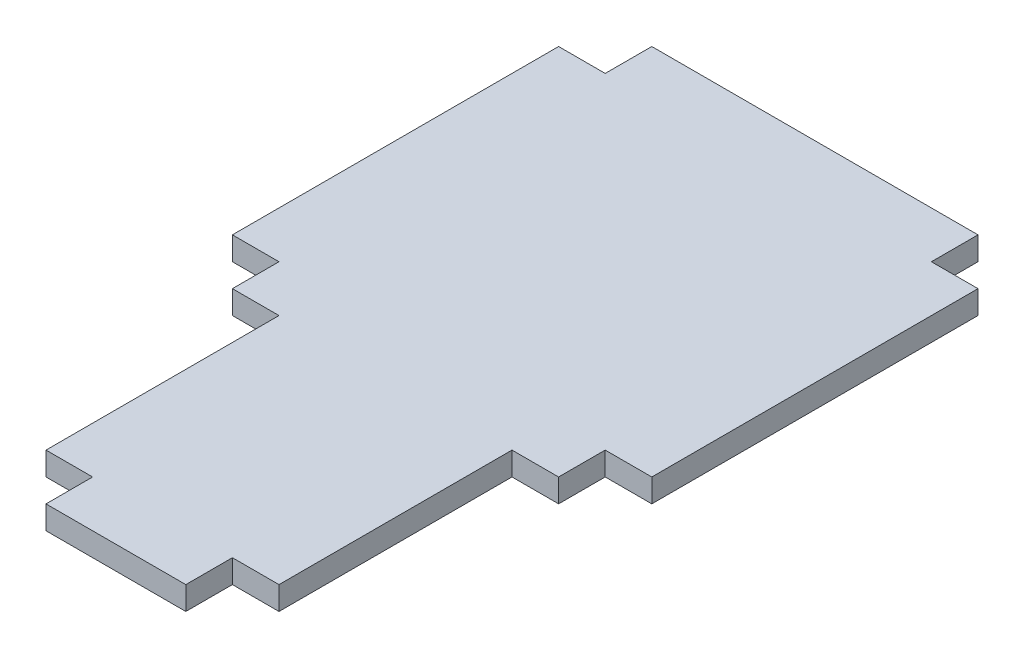
ISO-10303-21;
HEADER;
FILE_DESCRIPTION(('STEP AP214'),'2;1');
FILE_NAME('part.step','',(''),(''),'','','');
FILE_SCHEMA(('AUTOMOTIVE_DESIGN { 1 0 10303 214 1 1 1 1 }'));
ENDSEC;
DATA;
#1=APPLICATION_CONTEXT('core data for automotive mechanical design processes');
#2=APPLICATION_PROTOCOL_DEFINITION('international standard','automotive_design',2000,#1);
#3=PRODUCT_CONTEXT('',#1,'mechanical');
#4=PRODUCT('Part','Part','',(#3));
#5=PRODUCT_RELATED_PRODUCT_CATEGORY('part','',(#4));
#6=PRODUCT_DEFINITION_FORMATION('','',#4);
#7=PRODUCT_DEFINITION_CONTEXT('part definition',#1,'design');
#8=PRODUCT_DEFINITION('design','',#6,#7);
#9=PRODUCT_DEFINITION_SHAPE('','',#8);
#10=(LENGTH_UNIT() NAMED_UNIT(*) SI_UNIT(.MILLI.,.METRE.));
#11=(NAMED_UNIT(*) PLANE_ANGLE_UNIT() SI_UNIT($,.RADIAN.));
#12=(NAMED_UNIT(*) SI_UNIT($,.STERADIAN.) SOLID_ANGLE_UNIT());
#13=UNCERTAINTY_MEASURE_WITH_UNIT(LENGTH_MEASURE(1.E-05),#10,'distance_accuracy_value','');
#14=(GEOMETRIC_REPRESENTATION_CONTEXT(3) GLOBAL_UNCERTAINTY_ASSIGNED_CONTEXT((#13)) GLOBAL_UNIT_ASSIGNED_CONTEXT((#10,
#11,#12)) REPRESENTATION_CONTEXT('',''));
#15=CARTESIAN_POINT('',(0.,0.,0.));
#16=DIRECTION('',(0.,0.,1.));
#17=DIRECTION('',(1.,0.,0.));
#18=AXIS2_PLACEMENT_3D('',#15,#16,#17);
#19=CARTESIAN_POINT('',(-9.525,-3.175,66.675));
#20=DIRECTION('',(-1.,0.,0.));
#21=DIRECTION('',(0.,0.,1.));
#22=AXIS2_PLACEMENT_3D('',#19,#20,#21);
#23=PLANE('',#22);
#24=DIRECTION('',(0.,0.,1.));
#25=VECTOR('',#24,1.);
#26=CARTESIAN_POINT('',(-9.525,0.,66.675));
#27=LINE('',#26,#25);
#28=CARTESIAN_POINT('',(-9.525,0.,60.325));
#29=VERTEX_POINT('',#28);
#30=CARTESIAN_POINT('',(-9.525,0.,66.675));
#31=VERTEX_POINT('',#30);
#32=EDGE_CURVE('E192',#29,#31,#27,.T.);
#33=ORIENTED_EDGE('',*,*,#32,.F.);
#34=DIRECTION('',(0.,1.,0.));
#35=VECTOR('',#34,1.);
#36=CARTESIAN_POINT('',(-9.525,-3.175,60.325));
#37=LINE('',#36,#35);
#38=CARTESIAN_POINT('',(-9.525,-3.175,60.325));
#39=VERTEX_POINT('',#38);
#40=EDGE_CURVE('E32',#39,#29,#37,.T.);
#41=ORIENTED_EDGE('',*,*,#40,.F.);
#42=DIRECTION('',(0.,0.,1.));
#43=VECTOR('',#42,1.);
#44=CARTESIAN_POINT('',(-9.525,-3.175,66.675));
#45=LINE('',#44,#43);
#46=CARTESIAN_POINT('',(-9.525,-3.175,66.675));
#47=VERTEX_POINT('',#46);
#48=EDGE_CURVE('E183',#39,#47,#45,.T.);
#49=ORIENTED_EDGE('',*,*,#48,.T.);
#50=DIRECTION('',(0.,1.,0.));
#51=VECTOR('',#50,1.);
#52=CARTESIAN_POINT('',(-9.525,-3.175,66.675));
#53=LINE('',#52,#51);
#54=EDGE_CURVE('E10',#47,#31,#53,.T.);
#55=ORIENTED_EDGE('',*,*,#54,.T.);
#56=EDGE_LOOP('',(#33,#41,#49,#55));
#57=FACE_BOUND('',#56,.T.);
#58=ADVANCED_FACE('F16',(#57),#23,.T.);
#59=CARTESIAN_POINT('',(0.,-3.175,66.675));
#60=DIRECTION('',(0.,0.,1.));
#61=DIRECTION('',(1.,0.,0.));
#62=AXIS2_PLACEMENT_3D('',#59,#60,#61);
#63=PLANE('',#62);
#64=DIRECTION('',(1.,0.,0.));
#65=VECTOR('',#64,1.);
#66=CARTESIAN_POINT('',(0.,0.,66.675));
#67=LINE('',#66,#65);
#68=CARTESIAN_POINT('',(9.525,0.,66.675));
#69=VERTEX_POINT('',#68);
#70=EDGE_CURVE('E187',#31,#69,#67,.T.);
#71=ORIENTED_EDGE('',*,*,#70,.F.);
#72=ORIENTED_EDGE('',*,*,#54,.F.);
#73=DIRECTION('',(1.,0.,0.));
#74=VECTOR('',#73,1.);
#75=CARTESIAN_POINT('',(-9.525,-3.175,66.675));
#76=LINE('',#75,#74);
#77=CARTESIAN_POINT('',(9.525,-3.175,66.675));
#78=VERTEX_POINT('',#77);
#79=EDGE_CURVE('E185',#47,#78,#76,.T.);
#80=ORIENTED_EDGE('',*,*,#79,.T.);
#81=DIRECTION('',(0.,1.,0.));
#82=VECTOR('',#81,1.);
#83=CARTESIAN_POINT('',(9.525,-3.175,66.675));
#84=LINE('',#83,#82);
#85=EDGE_CURVE('E24',#78,#69,#84,.T.);
#86=ORIENTED_EDGE('',*,*,#85,.T.);
#87=EDGE_LOOP('',(#71,#72,#80,#86));
#88=FACE_BOUND('',#87,.T.);
#89=ADVANCED_FACE('F294',(#88),#63,.T.);
#90=CARTESIAN_POINT('',(9.525,-3.175,60.325));
#91=DIRECTION('',(1.,0.,0.));
#92=DIRECTION('',(0.,0.,-1.));
#93=AXIS2_PLACEMENT_3D('',#90,#91,#92);
#94=PLANE('',#93);
#95=DIRECTION('',(0.,0.,-1.));
#96=VECTOR('',#95,1.);
#97=CARTESIAN_POINT('',(9.525,0.,60.325));
#98=LINE('',#97,#96);
#99=CARTESIAN_POINT('',(9.525,0.,60.325));
#100=VERTEX_POINT('',#99);
#101=EDGE_CURVE('E191',#69,#100,#98,.T.);
#102=ORIENTED_EDGE('',*,*,#101,.F.);
#103=ORIENTED_EDGE('',*,*,#85,.F.);
#104=DIRECTION('',(0.,0.,-1.));
#105=VECTOR('',#104,1.);
#106=CARTESIAN_POINT('',(9.525,-3.175,60.325));
#107=LINE('',#106,#105);
#108=CARTESIAN_POINT('',(9.525,-3.175,60.325));
#109=VERTEX_POINT('',#108);
#110=EDGE_CURVE('E303',#78,#109,#107,.T.);
#111=ORIENTED_EDGE('',*,*,#110,.T.);
#112=DIRECTION('',(0.,1.,0.));
#113=VECTOR('',#112,1.);
#114=CARTESIAN_POINT('',(9.525,-3.175,60.325));
#115=LINE('',#114,#113);
#116=EDGE_CURVE('E291',#109,#100,#115,.T.);
#117=ORIENTED_EDGE('',*,*,#116,.T.);
#118=EDGE_LOOP('',(#102,#103,#111,#117));
#119=FACE_BOUND('',#118,.T.);
#120=ADVANCED_FACE('F298',(#119),#94,.T.);
#121=CARTESIAN_POINT('',(15.875,-3.175,60.325));
#122=DIRECTION('',(0.,0.,1.));
#123=DIRECTION('',(1.,0.,0.));
#124=AXIS2_PLACEMENT_3D('',#121,#122,#123);
#125=PLANE('',#124);
#126=DIRECTION('',(1.,0.,0.));
#127=VECTOR('',#126,1.);
#128=CARTESIAN_POINT('',(15.875,0.,60.325));
#129=LINE('',#128,#127);
#130=CARTESIAN_POINT('',(15.875,0.,60.325));
#131=VERTEX_POINT('',#130);
#132=EDGE_CURVE('E196',#100,#131,#129,.T.);
#133=ORIENTED_EDGE('',*,*,#132,.F.);
#134=ORIENTED_EDGE('',*,*,#116,.F.);
#135=DIRECTION('',(1.,0.,0.));
#136=VECTOR('',#135,1.);
#137=CARTESIAN_POINT('',(15.875,-3.175,60.325));
#138=LINE('',#137,#136);
#139=CARTESIAN_POINT('',(15.875,-3.175,60.325));
#140=VERTEX_POINT('',#139);
#141=EDGE_CURVE('E305',#109,#140,#138,.T.);
#142=ORIENTED_EDGE('',*,*,#141,.T.);
#143=DIRECTION('',(0.,1.,0.));
#144=VECTOR('',#143,1.);
#145=CARTESIAN_POINT('',(15.875,-3.175,60.325));
#146=LINE('',#145,#144);
#147=EDGE_CURVE('E289',#140,#131,#146,.T.);
#148=ORIENTED_EDGE('',*,*,#147,.T.);
#149=EDGE_LOOP('',(#133,#134,#142,#148));
#150=FACE_BOUND('',#149,.T.);
#151=ADVANCED_FACE('F397',(#150),#125,.T.);
#152=CARTESIAN_POINT('',(15.875,-3.175,60.325));
#153=DIRECTION('',(1.,0.,0.));
#154=DIRECTION('',(0.,0.,-1.));
#155=AXIS2_PLACEMENT_3D('',#152,#153,#154);
#156=PLANE('',#155);
#157=DIRECTION('',(0.,0.,-1.));
#158=VECTOR('',#157,1.);
#159=CARTESIAN_POINT('',(15.875,0.,60.325));
#160=LINE('',#159,#158);
#161=CARTESIAN_POINT('',(15.875,0.,28.575));
#162=VERTEX_POINT('',#161);
#163=EDGE_CURVE('E200',#131,#162,#160,.T.);
#164=ORIENTED_EDGE('',*,*,#163,.F.);
#165=ORIENTED_EDGE('',*,*,#147,.F.);
#166=DIRECTION('',(0.,0.,-1.));
#167=VECTOR('',#166,1.);
#168=CARTESIAN_POINT('',(15.875,-3.175,60.325));
#169=LINE('',#168,#167);
#170=CARTESIAN_POINT('',(15.875,-3.175,28.575));
#171=VERTEX_POINT('',#170);
#172=EDGE_CURVE('E310',#140,#171,#169,.T.);
#173=ORIENTED_EDGE('',*,*,#172,.T.);
#174=DIRECTION('',(0.,1.,0.));
#175=VECTOR('',#174,1.);
#176=CARTESIAN_POINT('',(15.875,-3.175,28.575));
#177=LINE('',#176,#175);
#178=EDGE_CURVE('E287',#171,#162,#177,.T.);
#179=ORIENTED_EDGE('',*,*,#178,.T.);
#180=EDGE_LOOP('',(#164,#165,#173,#179));
#181=FACE_BOUND('',#180,.T.);
#182=ADVANCED_FACE('F395',(#181),#156,.T.);
#183=CARTESIAN_POINT('',(15.875,-3.175,28.575));
#184=DIRECTION('',(0.,0.,1.));
#185=DIRECTION('',(1.,0.,0.));
#186=AXIS2_PLACEMENT_3D('',#183,#184,#185);
#187=PLANE('',#186);
#188=DIRECTION('',(1.,0.,0.));
#189=VECTOR('',#188,1.);
#190=CARTESIAN_POINT('',(15.875,0.,28.575));
#191=LINE('',#190,#189);
#192=CARTESIAN_POINT('',(22.225,0.,28.575));
#193=VERTEX_POINT('',#192);
#194=EDGE_CURVE('E204',#162,#193,#191,.T.);
#195=ORIENTED_EDGE('',*,*,#194,.F.);
#196=ORIENTED_EDGE('',*,*,#178,.F.);
#197=DIRECTION('',(1.,0.,0.));
#198=VECTOR('',#197,1.);
#199=CARTESIAN_POINT('',(15.875,-3.175,28.575));
#200=LINE('',#199,#198);
#201=CARTESIAN_POINT('',(22.225,-3.175,28.575));
#202=VERTEX_POINT('',#201);
#203=EDGE_CURVE('E313',#171,#202,#200,.T.);
#204=ORIENTED_EDGE('',*,*,#203,.T.);
#205=DIRECTION('',(0.,1.,0.));
#206=VECTOR('',#205,1.);
#207=CARTESIAN_POINT('',(22.225,-3.175,28.575));
#208=LINE('',#207,#206);
#209=EDGE_CURVE('E285',#202,#193,#208,.T.);
#210=ORIENTED_EDGE('',*,*,#209,.T.);
#211=EDGE_LOOP('',(#195,#196,#204,#210));
#212=FACE_BOUND('',#211,.T.);
#213=ADVANCED_FACE('F392',(#212),#187,.T.);
#214=CARTESIAN_POINT('',(22.225,-3.175,22.225));
#215=DIRECTION('',(1.,0.,0.));
#216=DIRECTION('',(0.,0.,-1.));
#217=AXIS2_PLACEMENT_3D('',#214,#215,#216);
#218=PLANE('',#217);
#219=DIRECTION('',(0.,0.,-1.));
#220=VECTOR('',#219,1.);
#221=CARTESIAN_POINT('',(22.225,0.,22.225));
#222=LINE('',#221,#220);
#223=CARTESIAN_POINT('',(22.225,0.,22.225));
#224=VERTEX_POINT('',#223);
#225=EDGE_CURVE('E208',#193,#224,#222,.T.);
#226=ORIENTED_EDGE('',*,*,#225,.F.);
#227=ORIENTED_EDGE('',*,*,#209,.F.);
#228=DIRECTION('',(0.,0.,-1.));
#229=VECTOR('',#228,1.);
#230=CARTESIAN_POINT('',(22.225,-3.175,22.225));
#231=LINE('',#230,#229);
#232=CARTESIAN_POINT('',(22.225,-3.175,22.225));
#233=VERTEX_POINT('',#232);
#234=EDGE_CURVE('E316',#202,#233,#231,.T.);
#235=ORIENTED_EDGE('',*,*,#234,.T.);
#236=DIRECTION('',(0.,1.,0.));
#237=VECTOR('',#236,1.);
#238=CARTESIAN_POINT('',(22.225,-3.175,22.225));
#239=LINE('',#238,#237);
#240=EDGE_CURVE('E283',#233,#224,#239,.T.);
#241=ORIENTED_EDGE('',*,*,#240,.T.);
#242=EDGE_LOOP('',(#226,#227,#235,#241));
#243=FACE_BOUND('',#242,.T.);
#244=ADVANCED_FACE('F389',(#243),#218,.T.);
#245=CARTESIAN_POINT('',(28.575,-3.175,22.225));
#246=DIRECTION('',(0.,0.,1.));
#247=DIRECTION('',(1.,0.,0.));
#248=AXIS2_PLACEMENT_3D('',#245,#246,#247);
#249=PLANE('',#248);
#250=DIRECTION('',(1.,0.,0.));
#251=VECTOR('',#250,1.);
#252=CARTESIAN_POINT('',(28.575,0.,22.225));
#253=LINE('',#252,#251);
#254=CARTESIAN_POINT('',(28.575,0.,22.225));
#255=VERTEX_POINT('',#254);
#256=EDGE_CURVE('E212',#224,#255,#253,.T.);
#257=ORIENTED_EDGE('',*,*,#256,.F.);
#258=ORIENTED_EDGE('',*,*,#240,.F.);
#259=DIRECTION('',(1.,0.,0.));
#260=VECTOR('',#259,1.);
#261=CARTESIAN_POINT('',(28.575,-3.175,22.225));
#262=LINE('',#261,#260);
#263=CARTESIAN_POINT('',(28.575,-3.175,22.225));
#264=VERTEX_POINT('',#263);
#265=EDGE_CURVE('E319',#233,#264,#262,.T.);
#266=ORIENTED_EDGE('',*,*,#265,.T.);
#267=DIRECTION('',(0.,1.,0.));
#268=VECTOR('',#267,1.);
#269=CARTESIAN_POINT('',(28.575,-3.175,22.225));
#270=LINE('',#269,#268);
#271=EDGE_CURVE('E281',#264,#255,#270,.T.);
#272=ORIENTED_EDGE('',*,*,#271,.T.);
#273=EDGE_LOOP('',(#257,#258,#266,#272));
#274=FACE_BOUND('',#273,.T.);
#275=ADVANCED_FACE('F383',(#274),#249,.T.);
#276=CARTESIAN_POINT('',(28.575,-3.175,22.225));
#277=DIRECTION('',(1.,0.,0.));
#278=DIRECTION('',(0.,0.,-1.));
#279=AXIS2_PLACEMENT_3D('',#276,#277,#278);
#280=PLANE('',#279);
#281=DIRECTION('',(0.,0.,-1.));
#282=VECTOR('',#281,1.);
#283=CARTESIAN_POINT('',(28.575,0.,22.225));
#284=LINE('',#283,#282);
#285=CARTESIAN_POINT('',(28.575,0.,-22.225));
#286=VERTEX_POINT('',#285);
#287=EDGE_CURVE('E216',#255,#286,#284,.T.);
#288=ORIENTED_EDGE('',*,*,#287,.F.);
#289=ORIENTED_EDGE('',*,*,#271,.F.);
#290=DIRECTION('',(0.,0.,-1.));
#291=VECTOR('',#290,1.);
#292=CARTESIAN_POINT('',(28.575,-3.175,22.225));
#293=LINE('',#292,#291);
#294=CARTESIAN_POINT('',(28.575,-3.175,-22.225));
#295=VERTEX_POINT('',#294);
#296=EDGE_CURVE('E322',#264,#295,#293,.T.);
#297=ORIENTED_EDGE('',*,*,#296,.T.);
#298=DIRECTION('',(0.,1.,0.));
#299=VECTOR('',#298,1.);
#300=CARTESIAN_POINT('',(28.575,-3.175,-22.225));
#301=LINE('',#300,#299);
#302=EDGE_CURVE('E279',#295,#286,#301,.T.);
#303=ORIENTED_EDGE('',*,*,#302,.T.);
#304=EDGE_LOOP('',(#288,#289,#297,#303));
#305=FACE_BOUND('',#304,.T.);
#306=ADVANCED_FACE('F380',(#305),#280,.T.);
#307=CARTESIAN_POINT('',(22.225,-3.175,-22.225));
#308=DIRECTION('',(0.,0.,-1.));
#309=DIRECTION('',(-1.,0.,0.));
#310=AXIS2_PLACEMENT_3D('',#307,#308,#309);
#311=PLANE('',#310);
#312=DIRECTION('',(-1.,0.,0.));
#313=VECTOR('',#312,1.);
#314=CARTESIAN_POINT('',(22.225,0.,-22.225));
#315=LINE('',#314,#313);
#316=CARTESIAN_POINT('',(22.225,0.,-22.225));
#317=VERTEX_POINT('',#316);
#318=EDGE_CURVE('E220',#286,#317,#315,.T.);
#319=ORIENTED_EDGE('',*,*,#318,.F.);
#320=ORIENTED_EDGE('',*,*,#302,.F.);
#321=DIRECTION('',(-1.,0.,0.));
#322=VECTOR('',#321,1.);
#323=CARTESIAN_POINT('',(22.225,-3.175,-22.225));
#324=LINE('',#323,#322);
#325=CARTESIAN_POINT('',(22.225,-3.175,-22.225));
#326=VERTEX_POINT('',#325);
#327=EDGE_CURVE('E325',#295,#326,#324,.T.);
#328=ORIENTED_EDGE('',*,*,#327,.T.);
#329=DIRECTION('',(0.,1.,0.));
#330=VECTOR('',#329,1.);
#331=CARTESIAN_POINT('',(22.225,-3.175,-22.225));
#332=LINE('',#331,#330);
#333=EDGE_CURVE('E277',#326,#317,#332,.T.);
#334=ORIENTED_EDGE('',*,*,#333,.T.);
#335=EDGE_LOOP('',(#319,#320,#328,#334));
#336=FACE_BOUND('',#335,.T.);
#337=ADVANCED_FACE('F377',(#336),#311,.T.);
#338=CARTESIAN_POINT('',(22.225,-3.175,-28.575));
#339=DIRECTION('',(1.,0.,0.));
#340=DIRECTION('',(0.,0.,-1.));
#341=AXIS2_PLACEMENT_3D('',#338,#339,#340);
#342=PLANE('',#341);
#343=DIRECTION('',(0.,0.,-1.));
#344=VECTOR('',#343,1.);
#345=CARTESIAN_POINT('',(22.225,0.,-28.575));
#346=LINE('',#345,#344);
#347=CARTESIAN_POINT('',(22.225,0.,-28.575));
#348=VERTEX_POINT('',#347);
#349=EDGE_CURVE('E224',#317,#348,#346,.T.);
#350=ORIENTED_EDGE('',*,*,#349,.F.);
#351=ORIENTED_EDGE('',*,*,#333,.F.);
#352=DIRECTION('',(0.,0.,-1.));
#353=VECTOR('',#352,1.);
#354=CARTESIAN_POINT('',(22.225,-3.175,-28.575));
#355=LINE('',#354,#353);
#356=CARTESIAN_POINT('',(22.225,-3.175,-28.575));
#357=VERTEX_POINT('',#356);
#358=EDGE_CURVE('E328',#326,#357,#355,.T.);
#359=ORIENTED_EDGE('',*,*,#358,.T.);
#360=DIRECTION('',(0.,1.,0.));
#361=VECTOR('',#360,1.);
#362=CARTESIAN_POINT('',(22.225,-3.175,-28.575));
#363=LINE('',#362,#361);
#364=EDGE_CURVE('E275',#357,#348,#363,.T.);
#365=ORIENTED_EDGE('',*,*,#364,.T.);
#366=EDGE_LOOP('',(#350,#351,#359,#365));
#367=FACE_BOUND('',#366,.T.);
#368=ADVANCED_FACE('F371',(#367),#342,.T.);
#369=CARTESIAN_POINT('',(22.225,-3.175,-28.575));
#370=DIRECTION('',(0.,0.,-1.));
#371=DIRECTION('',(-1.,0.,0.));
#372=AXIS2_PLACEMENT_3D('',#369,#370,#371);
#373=PLANE('',#372);
#374=DIRECTION('',(-1.,0.,0.));
#375=VECTOR('',#374,1.);
#376=CARTESIAN_POINT('',(22.225,0.,-28.575));
#377=LINE('',#376,#375);
#378=CARTESIAN_POINT('',(-22.225,0.,-28.575));
#379=VERTEX_POINT('',#378);
#380=EDGE_CURVE('E228',#348,#379,#377,.T.);
#381=ORIENTED_EDGE('',*,*,#380,.F.);
#382=ORIENTED_EDGE('',*,*,#364,.F.);
#383=DIRECTION('',(-1.,0.,0.));
#384=VECTOR('',#383,1.);
#385=CARTESIAN_POINT('',(22.225,-3.175,-28.575));
#386=LINE('',#385,#384);
#387=CARTESIAN_POINT('',(-22.225,-3.175,-28.575));
#388=VERTEX_POINT('',#387);
#389=EDGE_CURVE('E331',#357,#388,#386,.T.);
#390=ORIENTED_EDGE('',*,*,#389,.T.);
#391=DIRECTION('',(0.,1.,0.));
#392=VECTOR('',#391,1.);
#393=CARTESIAN_POINT('',(-22.225,-3.175,-28.575));
#394=LINE('',#393,#392);
#395=EDGE_CURVE('E273',#388,#379,#394,.T.);
#396=ORIENTED_EDGE('',*,*,#395,.T.);
#397=EDGE_LOOP('',(#381,#382,#390,#396));
#398=FACE_BOUND('',#397,.T.);
#399=ADVANCED_FACE('F368',(#398),#373,.T.);
#400=CARTESIAN_POINT('',(-22.225,-3.175,-22.225));
#401=DIRECTION('',(-1.,0.,0.));
#402=DIRECTION('',(0.,0.,1.));
#403=AXIS2_PLACEMENT_3D('',#400,#401,#402);
#404=PLANE('',#403);
#405=DIRECTION('',(0.,0.,1.));
#406=VECTOR('',#405,1.);
#407=CARTESIAN_POINT('',(-22.225,0.,-22.225));
#408=LINE('',#407,#406);
#409=CARTESIAN_POINT('',(-22.225,0.,-22.225));
#410=VERTEX_POINT('',#409);
#411=EDGE_CURVE('E232',#379,#410,#408,.T.);
#412=ORIENTED_EDGE('',*,*,#411,.F.);
#413=ORIENTED_EDGE('',*,*,#395,.F.);
#414=DIRECTION('',(0.,0.,1.));
#415=VECTOR('',#414,1.);
#416=CARTESIAN_POINT('',(-22.225,-3.175,-22.225));
#417=LINE('',#416,#415);
#418=CARTESIAN_POINT('',(-22.225,-3.175,-22.225));
#419=VERTEX_POINT('',#418);
#420=EDGE_CURVE('E334',#388,#419,#417,.T.);
#421=ORIENTED_EDGE('',*,*,#420,.T.);
#422=DIRECTION('',(0.,1.,0.));
#423=VECTOR('',#422,1.);
#424=CARTESIAN_POINT('',(-22.225,-3.175,-22.225));
#425=LINE('',#424,#423);
#426=EDGE_CURVE('E271',#419,#410,#425,.T.);
#427=ORIENTED_EDGE('',*,*,#426,.T.);
#428=EDGE_LOOP('',(#412,#413,#421,#427));
#429=FACE_BOUND('',#428,.T.);
#430=ADVANCED_FACE('F365',(#429),#404,.T.);
#431=CARTESIAN_POINT('',(-28.575,-3.175,-22.225));
#432=DIRECTION('',(0.,0.,-1.));
#433=DIRECTION('',(-1.,0.,0.));
#434=AXIS2_PLACEMENT_3D('',#431,#432,#433);
#435=PLANE('',#434);
#436=DIRECTION('',(-1.,0.,0.));
#437=VECTOR('',#436,1.);
#438=CARTESIAN_POINT('',(-28.575,0.,-22.225));
#439=LINE('',#438,#437);
#440=CARTESIAN_POINT('',(-28.575,0.,-22.225));
#441=VERTEX_POINT('',#440);
#442=EDGE_CURVE('E236',#410,#441,#439,.T.);
#443=ORIENTED_EDGE('',*,*,#442,.F.);
#444=ORIENTED_EDGE('',*,*,#426,.F.);
#445=DIRECTION('',(-1.,0.,0.));
#446=VECTOR('',#445,1.);
#447=CARTESIAN_POINT('',(-28.575,-3.175,-22.225));
#448=LINE('',#447,#446);
#449=CARTESIAN_POINT('',(-28.575,-3.175,-22.225));
#450=VERTEX_POINT('',#449);
#451=EDGE_CURVE('E337',#419,#450,#448,.T.);
#452=ORIENTED_EDGE('',*,*,#451,.T.);
#453=DIRECTION('',(0.,1.,0.));
#454=VECTOR('',#453,1.);
#455=CARTESIAN_POINT('',(-28.575,-3.175,-22.225));
#456=LINE('',#455,#454);
#457=EDGE_CURVE('E269',#450,#441,#456,.T.);
#458=ORIENTED_EDGE('',*,*,#457,.T.);
#459=EDGE_LOOP('',(#443,#444,#452,#458));
#460=FACE_BOUND('',#459,.T.);
#461=ADVANCED_FACE('F359',(#460),#435,.T.);
#462=CARTESIAN_POINT('',(-28.575,-3.175,-22.225));
#463=DIRECTION('',(-1.,0.,0.));
#464=DIRECTION('',(0.,0.,1.));
#465=AXIS2_PLACEMENT_3D('',#462,#463,#464);
#466=PLANE('',#465);
#467=DIRECTION('',(0.,0.,1.));
#468=VECTOR('',#467,1.);
#469=CARTESIAN_POINT('',(-28.575,0.,-22.225));
#470=LINE('',#469,#468);
#471=CARTESIAN_POINT('',(-28.575,0.,22.225));
#472=VERTEX_POINT('',#471);
#473=EDGE_CURVE('E240',#441,#472,#470,.T.);
#474=ORIENTED_EDGE('',*,*,#473,.F.);
#475=ORIENTED_EDGE('',*,*,#457,.F.);
#476=DIRECTION('',(0.,0.,1.));
#477=VECTOR('',#476,1.);
#478=CARTESIAN_POINT('',(-28.575,-3.175,-22.225));
#479=LINE('',#478,#477);
#480=CARTESIAN_POINT('',(-28.575,-3.175,22.225));
#481=VERTEX_POINT('',#480);
#482=EDGE_CURVE('E340',#450,#481,#479,.T.);
#483=ORIENTED_EDGE('',*,*,#482,.T.);
#484=DIRECTION('',(0.,1.,0.));
#485=VECTOR('',#484,1.);
#486=CARTESIAN_POINT('',(-28.575,-3.175,22.225));
#487=LINE('',#486,#485);
#488=EDGE_CURVE('E267',#481,#472,#487,.T.);
#489=ORIENTED_EDGE('',*,*,#488,.T.);
#490=EDGE_LOOP('',(#474,#475,#483,#489));
#491=FACE_BOUND('',#490,.T.);
#492=ADVANCED_FACE('F356',(#491),#466,.T.);
#493=CARTESIAN_POINT('',(-22.225,-3.175,22.225));
#494=DIRECTION('',(0.,0.,1.));
#495=DIRECTION('',(1.,0.,0.));
#496=AXIS2_PLACEMENT_3D('',#493,#494,#495);
#497=PLANE('',#496);
#498=DIRECTION('',(1.,0.,0.));
#499=VECTOR('',#498,1.);
#500=CARTESIAN_POINT('',(-22.225,0.,22.225));
#501=LINE('',#500,#499);
#502=CARTESIAN_POINT('',(-22.225,0.,22.225));
#503=VERTEX_POINT('',#502);
#504=EDGE_CURVE('E244',#472,#503,#501,.T.);
#505=ORIENTED_EDGE('',*,*,#504,.F.);
#506=ORIENTED_EDGE('',*,*,#488,.F.);
#507=DIRECTION('',(1.,0.,0.));
#508=VECTOR('',#507,1.);
#509=CARTESIAN_POINT('',(-22.225,-3.175,22.225));
#510=LINE('',#509,#508);
#511=CARTESIAN_POINT('',(-22.225,-3.175,22.225));
#512=VERTEX_POINT('',#511);
#513=EDGE_CURVE('E343',#481,#512,#510,.T.);
#514=ORIENTED_EDGE('',*,*,#513,.T.);
#515=DIRECTION('',(0.,1.,0.));
#516=VECTOR('',#515,1.);
#517=CARTESIAN_POINT('',(-22.225,-3.175,22.225));
#518=LINE('',#517,#516);
#519=EDGE_CURVE('E265',#512,#503,#518,.T.);
#520=ORIENTED_EDGE('',*,*,#519,.T.);
#521=EDGE_LOOP('',(#505,#506,#514,#520));
#522=FACE_BOUND('',#521,.T.);
#523=ADVANCED_FACE('F353',(#522),#497,.T.);
#524=CARTESIAN_POINT('',(-22.225,-3.175,28.575));
#525=DIRECTION('',(-1.,0.,0.));
#526=DIRECTION('',(0.,0.,1.));
#527=AXIS2_PLACEMENT_3D('',#524,#525,#526);
#528=PLANE('',#527);
#529=DIRECTION('',(0.,0.,1.));
#530=VECTOR('',#529,1.);
#531=CARTESIAN_POINT('',(-22.225,0.,28.575));
#532=LINE('',#531,#530);
#533=CARTESIAN_POINT('',(-22.225,0.,28.575));
#534=VERTEX_POINT('',#533);
#535=EDGE_CURVE('E248',#503,#534,#532,.T.);
#536=ORIENTED_EDGE('',*,*,#535,.F.);
#537=ORIENTED_EDGE('',*,*,#519,.F.);
#538=DIRECTION('',(0.,0.,1.));
#539=VECTOR('',#538,1.);
#540=CARTESIAN_POINT('',(-22.225,-3.175,28.575));
#541=LINE('',#540,#539);
#542=CARTESIAN_POINT('',(-22.225,-3.175,28.575));
#543=VERTEX_POINT('',#542);
#544=EDGE_CURVE('E174',#512,#543,#541,.T.);
#545=ORIENTED_EDGE('',*,*,#544,.T.);
#546=DIRECTION('',(0.,1.,0.));
#547=VECTOR('',#546,1.);
#548=CARTESIAN_POINT('',(-22.225,-3.175,28.575));
#549=LINE('',#548,#547);
#550=EDGE_CURVE('E166',#543,#534,#549,.T.);
#551=ORIENTED_EDGE('',*,*,#550,.T.);
#552=EDGE_LOOP('',(#536,#537,#545,#551));
#553=FACE_BOUND('',#552,.T.);
#554=ADVANCED_FACE('F347',(#553),#528,.T.);
#555=CARTESIAN_POINT('',(-22.225,-3.175,28.575));
#556=DIRECTION('',(0.,0.,1.));
#557=DIRECTION('',(1.,0.,0.));
#558=AXIS2_PLACEMENT_3D('',#555,#556,#557);
#559=PLANE('',#558);
#560=DIRECTION('',(1.,0.,0.));
#561=VECTOR('',#560,1.);
#562=CARTESIAN_POINT('',(-22.225,0.,28.575));
#563=LINE('',#562,#561);
#564=CARTESIAN_POINT('',(-15.875,0.,28.575));
#565=VERTEX_POINT('',#564);
#566=EDGE_CURVE('E252',#534,#565,#563,.T.);
#567=ORIENTED_EDGE('',*,*,#566,.F.);
#568=ORIENTED_EDGE('',*,*,#550,.F.);
#569=DIRECTION('',(1.,0.,0.));
#570=VECTOR('',#569,1.);
#571=CARTESIAN_POINT('',(-22.225,-3.175,28.575));
#572=LINE('',#571,#570);
#573=CARTESIAN_POINT('',(-15.875,-3.175,28.575));
#574=VERTEX_POINT('',#573);
#575=EDGE_CURVE('E169',#543,#574,#572,.T.);
#576=ORIENTED_EDGE('',*,*,#575,.T.);
#577=DIRECTION('',(0.,1.,0.));
#578=VECTOR('',#577,1.);
#579=CARTESIAN_POINT('',(-15.875,-3.175,28.575));
#580=LINE('',#579,#578);
#581=EDGE_CURVE('E155',#574,#565,#580,.T.);
#582=ORIENTED_EDGE('',*,*,#581,.T.);
#583=EDGE_LOOP('',(#567,#568,#576,#582));
#584=FACE_BOUND('',#583,.T.);
#585=ADVANCED_FACE('F170',(#584),#559,.T.);
#586=CARTESIAN_POINT('',(-15.875,-3.175,28.575));
#587=DIRECTION('',(-1.,0.,0.));
#588=DIRECTION('',(0.,0.,1.));
#589=AXIS2_PLACEMENT_3D('',#586,#587,#588);
#590=PLANE('',#589);
#591=DIRECTION('',(0.,0.,1.));
#592=VECTOR('',#591,1.);
#593=CARTESIAN_POINT('',(-15.875,0.,28.575));
#594=LINE('',#593,#592);
#595=CARTESIAN_POINT('',(-15.875,0.,60.325));
#596=VERTEX_POINT('',#595);
#597=EDGE_CURVE('E162',#565,#596,#594,.T.);
#598=ORIENTED_EDGE('',*,*,#597,.F.);
#599=ORIENTED_EDGE('',*,*,#581,.F.);
#600=DIRECTION('',(0.,0.,1.));
#601=VECTOR('',#600,1.);
#602=CARTESIAN_POINT('',(-15.875,-3.175,28.575));
#603=LINE('',#602,#601);
#604=CARTESIAN_POINT('',(-15.875,-3.175,60.325));
#605=VERTEX_POINT('',#604);
#606=EDGE_CURVE('E159',#574,#605,#603,.T.);
#607=ORIENTED_EDGE('',*,*,#606,.T.);
#608=DIRECTION('',(0.,1.,0.));
#609=VECTOR('',#608,1.);
#610=CARTESIAN_POINT('',(-15.875,-3.175,60.325));
#611=LINE('',#610,#609);
#612=EDGE_CURVE('E97',#605,#596,#611,.T.);
#613=ORIENTED_EDGE('',*,*,#612,.T.);
#614=EDGE_LOOP('',(#598,#599,#607,#613));
#615=FACE_BOUND('',#614,.T.);
#616=ADVANCED_FACE('F157',(#615),#590,.T.);
#617=CARTESIAN_POINT('',(-9.525,-3.175,60.325));
#618=DIRECTION('',(0.,0.,1.));
#619=DIRECTION('',(1.,0.,0.));
#620=AXIS2_PLACEMENT_3D('',#617,#618,#619);
#621=PLANE('',#620);
#622=DIRECTION('',(1.,0.,0.));
#623=VECTOR('',#622,1.);
#624=CARTESIAN_POINT('',(-9.525,0.,60.325));
#625=LINE('',#624,#623);
#626=EDGE_CURVE('E186',#596,#29,#625,.T.);
#627=ORIENTED_EDGE('',*,*,#626,.F.);
#628=ORIENTED_EDGE('',*,*,#612,.F.);
#629=DIRECTION('',(1.,0.,0.));
#630=VECTOR('',#629,1.);
#631=CARTESIAN_POINT('',(-9.525,-3.175,60.325));
#632=LINE('',#631,#630);
#633=EDGE_CURVE('E178',#605,#39,#632,.T.);
#634=ORIENTED_EDGE('',*,*,#633,.T.);
#635=ORIENTED_EDGE('',*,*,#40,.T.);
#636=EDGE_LOOP('',(#627,#628,#634,#635));
#637=FACE_BOUND('',#636,.T.);
#638=ADVANCED_FACE('F548',(#637),#621,.T.);
#639=CARTESIAN_POINT('',(0.,-3.175,0.));
#640=DIRECTION('',(0.,1.,0.));
#641=DIRECTION('',(0.,0.,1.));
#642=AXIS2_PLACEMENT_3D('',#639,#640,#641);
#643=PLANE('',#642);
#644=ORIENTED_EDGE('',*,*,#48,.F.);
#645=ORIENTED_EDGE('',*,*,#633,.F.);
#646=ORIENTED_EDGE('',*,*,#606,.F.);
#647=ORIENTED_EDGE('',*,*,#575,.F.);
#648=ORIENTED_EDGE('',*,*,#544,.F.);
#649=ORIENTED_EDGE('',*,*,#513,.F.);
#650=ORIENTED_EDGE('',*,*,#482,.F.);
#651=ORIENTED_EDGE('',*,*,#451,.F.);
#652=ORIENTED_EDGE('',*,*,#420,.F.);
#653=ORIENTED_EDGE('',*,*,#389,.F.);
#654=ORIENTED_EDGE('',*,*,#358,.F.);
#655=ORIENTED_EDGE('',*,*,#327,.F.);
#656=ORIENTED_EDGE('',*,*,#296,.F.);
#657=ORIENTED_EDGE('',*,*,#265,.F.);
#658=ORIENTED_EDGE('',*,*,#234,.F.);
#659=ORIENTED_EDGE('',*,*,#203,.F.);
#660=ORIENTED_EDGE('',*,*,#172,.F.);
#661=ORIENTED_EDGE('',*,*,#141,.F.);
#662=ORIENTED_EDGE('',*,*,#110,.F.);
#663=ORIENTED_EDGE('',*,*,#79,.F.);
#664=EDGE_LOOP('',(#644,#645,#646,#647,#648,#649,#650,#651,#652,#653,#654,#655,#656,#657,#658,
#659,#660,#661,#662,#663));
#665=FACE_BOUND('',#664,.T.);
#666=ADVANCED_FACE('F177',(#665),#643,.F.);
#667=CARTESIAN_POINT('',(0.,0.,0.));
#668=DIRECTION('',(0.,1.,0.));
#669=DIRECTION('',(0.,0.,1.));
#670=AXIS2_PLACEMENT_3D('',#667,#668,#669);
#671=PLANE('',#670);
#672=ORIENTED_EDGE('',*,*,#32,.T.);
#673=ORIENTED_EDGE('',*,*,#70,.T.);
#674=ORIENTED_EDGE('',*,*,#101,.T.);
#675=ORIENTED_EDGE('',*,*,#132,.T.);
#676=ORIENTED_EDGE('',*,*,#163,.T.);
#677=ORIENTED_EDGE('',*,*,#194,.T.);
#678=ORIENTED_EDGE('',*,*,#225,.T.);
#679=ORIENTED_EDGE('',*,*,#256,.T.);
#680=ORIENTED_EDGE('',*,*,#287,.T.);
#681=ORIENTED_EDGE('',*,*,#318,.T.);
#682=ORIENTED_EDGE('',*,*,#349,.T.);
#683=ORIENTED_EDGE('',*,*,#380,.T.);
#684=ORIENTED_EDGE('',*,*,#411,.T.);
#685=ORIENTED_EDGE('',*,*,#442,.T.);
#686=ORIENTED_EDGE('',*,*,#473,.T.);
#687=ORIENTED_EDGE('',*,*,#504,.T.);
#688=ORIENTED_EDGE('',*,*,#535,.T.);
#689=ORIENTED_EDGE('',*,*,#566,.T.);
#690=ORIENTED_EDGE('',*,*,#597,.T.);
#691=ORIENTED_EDGE('',*,*,#626,.T.);
#692=EDGE_LOOP('',(#672,#673,#674,#675,#676,#677,#678,#679,#680,#681,#682,#683,#684,#685,#686,
#687,#688,#689,#690,#691));
#693=FACE_BOUND('',#692,.T.);
#694=ADVANCED_FACE('F301',(#693),#671,.T.);
#695=CLOSED_SHELL('',(#58,#89,#120,#151,#182,#213,#244,#275,#306,#337,#368,#399,#430,#461,#492,
#523,#554,#585,#616,#638,#666,#694));
#696=MANIFOLD_SOLID_BREP('B1',#695);
#697=ADVANCED_BREP_SHAPE_REPRESENTATION('',(#18,#696),#14);
#698=SHAPE_DEFINITION_REPRESENTATION(#9,#697);
ENDSEC;
END-ISO-10303-21;
